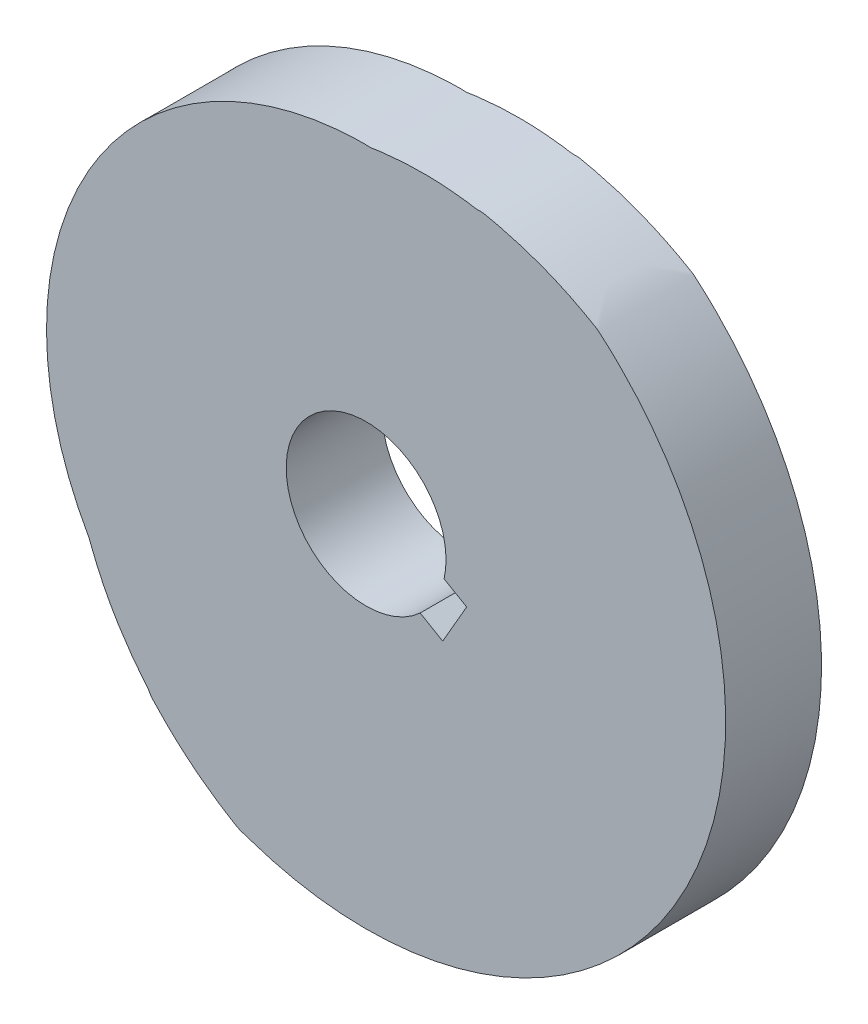
ISO-10303-21;
HEADER;
FILE_DESCRIPTION(('STEP AP214'),'2;1');
FILE_NAME('part.step','',(''),(''),'','','');
FILE_SCHEMA(('AUTOMOTIVE_DESIGN { 1 0 10303 214 1 1 1 1 }'));
ENDSEC;
DATA;
#1=APPLICATION_CONTEXT('core data for automotive mechanical design processes');
#2=APPLICATION_PROTOCOL_DEFINITION('international standard','automotive_design',2000,#1);
#3=PRODUCT_CONTEXT('',#1,'mechanical');
#4=PRODUCT('Part','Part','',(#3));
#5=PRODUCT_RELATED_PRODUCT_CATEGORY('part','',(#4));
#6=PRODUCT_DEFINITION_FORMATION('','',#4);
#7=PRODUCT_DEFINITION_CONTEXT('part definition',#1,'design');
#8=PRODUCT_DEFINITION('design','',#6,#7);
#9=PRODUCT_DEFINITION_SHAPE('','',#8);
#10=(LENGTH_UNIT() NAMED_UNIT(*) SI_UNIT(.MILLI.,.METRE.));
#11=(NAMED_UNIT(*) PLANE_ANGLE_UNIT() SI_UNIT($,.RADIAN.));
#12=(NAMED_UNIT(*) SI_UNIT($,.STERADIAN.) SOLID_ANGLE_UNIT());
#13=UNCERTAINTY_MEASURE_WITH_UNIT(LENGTH_MEASURE(1.E-05),#10,'distance_accuracy_value','');
#14=(GEOMETRIC_REPRESENTATION_CONTEXT(3) GLOBAL_UNCERTAINTY_ASSIGNED_CONTEXT((#13)) GLOBAL_UNIT_ASSIGNED_CONTEXT((#10,
#11,#12)) REPRESENTATION_CONTEXT('',''));
#15=CARTESIAN_POINT('',(0.,0.,0.));
#16=DIRECTION('',(0.,0.,1.));
#17=DIRECTION('',(1.,0.,0.));
#18=AXIS2_PLACEMENT_3D('',#15,#16,#17);
#19=CARTESIAN_POINT('',(-30.4297075312305,-28.4078394957122,12.));
#20=DIRECTION('',(0.,0.,1.));
#21=DIRECTION('',(1.,0.,0.));
#22=AXIS2_PLACEMENT_3D('',#19,#20,#21);
#23=PLANE('',#22);
#24=CARTESIAN_POINT('',(29.1412751431295,34.2897372843891,12.));
#25=CARTESIAN_POINT('',(29.0940531184966,34.3298691174571,12.));
#26=CARTESIAN_POINT('',(28.9994432668749,34.4099376885191,12.));
#27=CARTESIAN_POINT('',(28.8472369154073,34.5189527096457,12.));
#28=CARTESIAN_POINT('',(28.7406854181364,34.5822676387653,12.));
#29=CARTESIAN_POINT('',(28.6873436531217,34.6138134743216,12.));
#30=CARTESIAN_POINT('',(28.3117361485953,34.8359443424741,12.));
#31=CARTESIAN_POINT('',(27.7042465690321,35.183229789973,12.));
#32=CARTESIAN_POINT('',(26.8577301506666,35.6408530107318,12.));
#33=CARTESIAN_POINT('',(26.1581442048839,36.003024963318,12.));
#34=CARTESIAN_POINT('',(25.4541202093224,36.3516653481815,12.));
#35=CARTESIAN_POINT('',(24.7459168548474,36.6867299746915,12.));
#36=CARTESIAN_POINT('',(24.0337929960092,37.0081795325351,12.));
#37=CARTESIAN_POINT('',(23.3180075866082,37.3159796214028,12.));
#38=CARTESIAN_POINT('',(22.5988195740728,37.6101006621444,12.));
#39=CARTESIAN_POINT('',(21.8764878363164,37.8905181682813,12.));
#40=CARTESIAN_POINT('',(21.1512709922592,38.1572116894277,12.));
#41=CARTESIAN_POINT('',(20.4234276756753,38.4101686774383,12.));
#42=CARTESIAN_POINT('',(19.6932150911645,38.649370050824,12.));
#43=CARTESIAN_POINT('',(18.9608939559885,38.874843767902,12.));
#44=CARTESIAN_POINT('',(18.2267097119658,39.0864656457679,12.));
#45=CARTESIAN_POINT('',(17.4909619282007,39.2846994916511,12.));
#46=CARTESIAN_POINT('',(16.7537459630897,39.4678464637026,12.));
#47=CARTESIAN_POINT('',(16.0159125963348,39.6422670098176,12.));
#48=CARTESIAN_POINT('',(15.2755014323008,39.7843939838711,12.));
#49=CARTESIAN_POINT('',(14.5313919262129,39.9844797924808,12.));
#50=CARTESIAN_POINT('',(13.762708354936,39.9054361729313,12.));
#51=CARTESIAN_POINT('',(13.0194376581636,40.0766769337393,12.));
#52=CARTESIAN_POINT('',(12.280322435702,40.163894814137,12.));
#53=CARTESIAN_POINT('',(11.543345691416,40.2557653599944,12.));
#54=CARTESIAN_POINT('',(10.8065917236499,40.3293253185546,12.));
#55=CARTESIAN_POINT('',(10.0708820532317,40.3907640003285,12.));
#56=CARTESIAN_POINT('',(9.33630598468083,40.4384987986659,12.));
#57=CARTESIAN_POINT('',(8.60314610159427,40.473026129899,12.));
#58=CARTESIAN_POINT('',(7.87163127001196,40.4942931868513,12.));
#59=CARTESIAN_POINT('',(7.14200239455789,40.5023995298089,12.));
#60=CARTESIAN_POINT('',(6.41449492124119,40.4974080788568,12.));
#61=CARTESIAN_POINT('',(5.68934287734661,40.479402111312,12.));
#62=CARTESIAN_POINT('',(4.96677967179536,40.4484453581508,12.));
#63=CARTESIAN_POINT('',(4.24703045474375,40.4046841389308,12.));
#64=CARTESIAN_POINT('',(3.53034130696476,40.3479799078984,12.));
#65=CARTESIAN_POINT('',(2.81687013977248,40.279270984584,12.));
#66=CARTESIAN_POINT('',(2.10709178077384,40.1955139130306,12.));
#67=CARTESIAN_POINT('',(1.26956908956307,40.0923796876181,12.));
#68=CARTESIAN_POINT('',(0.673304876887302,39.9673385042817,12.));
#69=CARTESIAN_POINT('',(0.304549506720209,39.973916231467,12.));
#70=CARTESIAN_POINT('',(0.23667807433871,39.9751268979466,12.));
#71=CARTESIAN_POINT('',(0.101034893874037,39.9831366542034,12.));
#72=CARTESIAN_POINT('',(-0.102238967113295,40.0000421412801,12.));
#73=CARTESIAN_POINT('',(-0.238002098786821,39.9993495321864,12.));
#74=CARTESIAN_POINT('',(-0.305882343212708,39.9988304328028,12.));
#75=CARTESIAN_POINT('',(-34.5699432055108,39.7368034907363,12.));
#76=CARTESIAN_POINT('',(-51.6998400740398,10.0608678160656,12.));
#77=CARTESIAN_POINT('',(-34.7894399169696,-19.7406907240745,12.));
#78=CARTESIAN_POINT('',(-34.7569521902894,-19.7979445370832,12.));
#79=CARTESIAN_POINT('',(-34.6916940650224,-19.9122917656152,12.));
#80=CARTESIAN_POINT('',(-34.6076686927563,-20.0925037915658,12.));
#81=CARTESIAN_POINT('',(-34.5623470943252,-20.2161155515386,12.));
#82=CARTESIAN_POINT('',(-34.5395317834891,-20.2778643416509,12.));
#83=CARTESIAN_POINT('',(-34.4093377306533,-20.6302297027969,12.));
#84=CARTESIAN_POINT('',(-34.1883650620063,-21.2029939383914,12.));
#85=CARTESIAN_POINT('',(-33.8630207501085,-21.9912967058105,12.));
#86=CARTESIAN_POINT('',(-33.5776966025202,-22.6488410574114,12.));
#87=CARTESIAN_POINT('',(-33.2797044236173,-23.3031036811853,12.));
#88=CARTESIAN_POINT('',(-32.9690722355443,-23.953842162445,12.));
#89=CARTESIAN_POINT('',(-32.6458326619116,-24.6008140557401,12.));
#90=CARTESIAN_POINT('',(-32.3100229402291,-25.2437769839945,12.));
#91=CARTESIAN_POINT('',(-31.9616849788756,-25.8824887603255,12.));
#92=CARTESIAN_POINT('',(-31.6008651596752,-26.5167073266444,12.));
#93=CARTESIAN_POINT('',(-31.2276151076615,-27.1461914071554,12.));
#94=CARTESIAN_POINT('',(-30.8419888216236,-27.7706984759272,12.));
#95=CARTESIAN_POINT('',(-30.4440534399235,-28.389992795609,12.));
#96=CARTESIAN_POINT('',(-30.0338488866245,-29.0038157051352,12.));
#97=CARTESIAN_POINT('',(-29.6115391276648,-29.6119974147782,12.));
#98=CARTESIAN_POINT('',(-29.1768451935223,-30.2140383797002,12.));
#99=CARTESIAN_POINT('',(-28.7311703662056,-30.810678865856,12.));
#100=CARTESIAN_POINT('',(-28.2696343756967,-31.3980162168542,12.));
#101=CARTESIAN_POINT('',(-27.8109309747662,-31.9895550760374,12.));
#102=CARTESIAN_POINT('',(-27.2780638110927,-32.5411709015464,12.));
#103=CARTESIAN_POINT('',(-26.9464577659519,-33.2437690317535,12.));
#104=CARTESIAN_POINT('',(-26.3883421708551,-33.7811326659886,12.));
#105=CARTESIAN_POINT('',(-25.8817098571886,-34.3452665495698,12.));
#106=CARTESIAN_POINT('',(-25.3486835389016,-34.890469551493,12.));
#107=CARTESIAN_POINT('',(-24.8084489530987,-35.430594759126,12.));
#108=CARTESIAN_POINT('',(-24.2559953041513,-35.961626798261,12.));
#109=CARTESIAN_POINT('',(-23.6928284494156,-36.4843606751622,12.));
#110=CARTESIAN_POINT('',(-23.1187063728304,-36.9982993052098,12.));
#111=CARTESIAN_POINT('',(-22.5338630419058,-37.5032957989598,12.));
#112=CARTESIAN_POINT('',(-21.9384097923243,-37.9991112695572,12.));
#113=CARTESIAN_POINT('',(-21.3324970583894,-38.485535414802,12.));
#114=CARTESIAN_POINT('',(-20.7162682121557,-38.9623486020265,12.));
#115=CARTESIAN_POINT('',(-20.0898816996736,-39.4293530859889,12.));
#116=CARTESIAN_POINT('',(-19.4534684738452,-39.8862863660771,12.));
#117=CARTESIAN_POINT('',(-18.8072804358683,-40.3331382258481,12.));
#118=CARTESIAN_POINT('',(-18.1511369187545,-40.7689652129048,12.));
#119=CARTESIAN_POINT('',(-17.4864979636522,-41.1963330762877,12.));
#120=CARTESIAN_POINT('',(-16.6726514547271,-41.6866282224365,12.));
#121=CARTESIAN_POINT('',(-16.0920045671228,-42.06205154966,12.));
#122=CARTESIAN_POINT('',(-15.6910813545271,-42.2019162446332,12.));
#123=CARTESIAN_POINT('',(-15.6255064966387,-42.224792464339,12.));
#124=CARTESIAN_POINT('',(-15.4925846274541,-42.2654650125444,12.));
#125=CARTESIAN_POINT('',(-15.2919371493583,-42.322229720015,12.));
#126=CARTESIAN_POINT('',(-15.1611926322043,-42.3691286357486,12.));
#127=CARTESIAN_POINT('',(-15.0957664383165,-42.3924266307061,12.));
#128=CARTESIAN_POINT('',(46.2107285986174,-64.2234139976576,12.));
#129=CARTESIAN_POINT('',(78.7299346212942,-7.85339020145637,12.));
#130=CARTESIAN_POINT('',(29.1412751431295,34.2897372843891,12.));
#131=(BOUNDED_CURVE() B_SPLINE_CURVE(3,(#24,#25,#26,#27,#28,#29,#30,#31,#32,#33,#34,#35,#36,#37,
#38,#39,#40,#41,#42,#43,#44,#45,#46,#47,#48,#49,#50,#51,#52,#53,#54,#55,#56,#57,#58,#59,#60,#61,
#62,#63,#64,#65,#66,#67,#68,#69,#70,#71,#72,#73,#74,#75,#76,#77,#78,#79,#80,#81,#82,#83,#84,#85,
#86,#87,#88,#89,#90,#91,#92,#93,#94,#95,#96,#97,#98,#99,#100,#101,#102,#103,#104,#105,#106,#107,
#108,#109,#110,#111,#112,#113,#114,#115,#116,#117,#118,#119,#120,#121,#122,#123,#124,#125,#126,
#127,#128,#129,#130),.UNSPECIFIED.,.T.,.F.) B_SPLINE_CURVE_WITH_KNOTS((4,1,1,3,1,1,1,1,1,1,1,1,
1,1,1,1,1,1,1,1,1,1,1,1,1,1,1,1,1,1,1,1,1,1,1,1,1,1,1,1,1,3,1,1,3,3,1,1,3,1,1,1,1,1,1,1,1,1,1,1,
1,1,1,1,1,1,1,1,1,1,1,1,1,1,1,1,1,1,1,1,1,1,1,1,1,1,3,1,1,3,4),(0.,0.000850502477614867,
0.00170100495522973,0.0025515074328446,0.00854034400626003,0.0121538764877187,
0.0157575546443932,0.0193513791722436,0.0229353507729708,0.0265094701540788,0.0300737380289383,
0.0336281551168521,0.0371727221431197,0.0407074398391042,0.0442323089422995,0.0477473301963987,
0.0512525043513629,0.0547478321634917,0.0582333143954945,0.061708951816562,0.0651747452024399,
0.0686306953355029,0.0720768030048299,0.0756482273526375,0.0790648124334217,0.0824715582753685,
0.0858684657022437,0.0892555355449914,0.0926327686418171,0.0960001658382718,0.0993577279873376,
0.102705455949514,0.106043350592908,0.109371412793318,0.112689643434332,0.115998043407411,
0.11929661361199,0.122585354955567,0.125864268353801,0.129133354730611,0.132392615018271,
0.137450464963668,0.138381389767375,0.139312314571083,0.14024323937479,0.455559304746882,
0.456462071331177,0.457364837915473,0.458267604499769,0.463419181930307,0.466685829892808,
0.46996229754675,0.473248585815361,0.476544695613619,0.479850627848344,0.4831663834183,
0.486491963214284,0.489827368119224,0.493172599008267,0.49652765674887,0.499892542200892,
0.503267256216678,0.506651799641149,0.510046173311885,0.513450378059211,0.516864414706277,
0.520288284069144,0.523721986956861,0.527309648728311,0.530772856975955,0.534245901916114,
0.537728784323955,0.541221504968096,0.544724064610677,0.548236464007432,0.551758703907766,
0.555290785054814,0.558832708185522,0.562384474030707,0.565946083315127,0.569517536757549,
0.57309883507081,0.576689978961889,0.580290969131961,0.583901806276468,0.587522491085178,
0.593333175185337,0.594283568607703,0.595233962030068,0.596184355452434,1.),
.UNSPECIFIED.) CURVE() GEOMETRIC_REPRESENTATION_ITEM() RATIONAL_B_SPLINE_CURVE((1.,1.,1.,1.,1.,
1.,1.,1.,1.,1.,1.,1.,1.,1.,1.,1.,1.,1.,1.,1.,1.,1.,1.,1.,1.,1.,1.,1.,1.,1.,1.,1.,1.,1.,1.,1.,1.,
1.,1.,1.,1.,1.,1.,1.,1.,1.,1.,1.,1.,1.,1.,0.671020922044779,0.671020922044779,1.,1.,1.,1.,1.,1.,
1.,1.,1.,1.,1.,1.,1.,1.,1.,1.,1.,1.,1.,1.,1.,1.,1.,1.,1.,1.,1.,1.,1.,1.,1.,1.,1.,1.,1.,1.,1.,1.,
1.,1.,1.,1.,1.,1.,1.,1.,1.,1.,1.,1.,1.,0.453445281439712,0.453445281439712,1.)) REPRESENTATION_ITEM(''));
#132=CARTESIAN_POINT('',(29.1412751431295,34.2897372843891,12.));
#133=VERTEX_POINT('',#132);
#134=EDGE_CURVE('E119',#133,#133,#131,.T.);
#135=ORIENTED_EDGE('',*,*,#134,.T.);
#136=EDGE_LOOP('',(#135));
#137=FACE_BOUND('',#136,.T.);
#138=DIRECTION('',(0.866025403784439,-0.5,0.));
#139=VECTOR('',#138,1.);
#140=CARTESIAN_POINT('',(9.58512512714551,-8.99807618751146,12.));
#141=LINE('',#140,#139);
#142=CARTESIAN_POINT('',(6.76135582092916,-7.36777221843804,12.));
#143=VERTEX_POINT('',#142);
#144=CARTESIAN_POINT('',(9.58512512714551,-8.99807618751146,12.));
#145=VERTEX_POINT('',#144);
#146=EDGE_CURVE('E93',#143,#145,#141,.T.);
#147=ORIENTED_EDGE('',*,*,#146,.F.);
#148=CARTESIAN_POINT('',(0.,0.,12.));
#149=DIRECTION('',(0.,0.,1.));
#150=DIRECTION('',(1.,0.,0.));
#151=AXIS2_PLACEMENT_3D('',#148,#149,#150);
#152=CIRCLE('',#151,10.);
#153=CARTESIAN_POINT('',(9.76135582092916,-2.17161979573141,12.));
#154=VERTEX_POINT('',#153);
#155=EDGE_CURVE('E84',#154,#143,#152,.T.);
#156=ORIENTED_EDGE('',*,*,#155,.F.);
#157=DIRECTION('',(-0.866025403784439,0.5,0.));
#158=VECTOR('',#157,1.);
#159=CARTESIAN_POINT('',(9.76135582092916,-2.17161979573141,12.));
#160=LINE('',#159,#158);
#161=CARTESIAN_POINT('',(12.5851251271455,-3.80192376480482,12.));
#162=VERTEX_POINT('',#161);
#163=EDGE_CURVE('E109',#162,#154,#160,.T.);
#164=ORIENTED_EDGE('',*,*,#163,.F.);
#165=DIRECTION('',(0.5,0.866025403784439,0.));
#166=VECTOR('',#165,1.);
#167=CARTESIAN_POINT('',(12.5851251271455,-3.80192376480482,12.));
#168=LINE('',#167,#166);
#169=EDGE_CURVE('E105',#145,#162,#168,.T.);
#170=ORIENTED_EDGE('',*,*,#169,.F.);
#171=EDGE_LOOP('',(#147,#156,#164,#170));
#172=FACE_BOUND('',#171,.T.);
#173=ADVANCED_FACE('F43',(#137,#172),#23,.T.);
#174=CARTESIAN_POINT('',(-30.4297075312305,-28.4078394957122,0.));
#175=DIRECTION('',(0.,0.,1.));
#176=DIRECTION('',(1.,0.,0.));
#177=AXIS2_PLACEMENT_3D('',#174,#175,#176);
#178=PLANE('',#177);
#179=CARTESIAN_POINT('',(29.1412751431295,34.2897372843891,0.));
#180=CARTESIAN_POINT('',(29.0940531184966,34.3298691174571,0.));
#181=CARTESIAN_POINT('',(28.9994432668749,34.4099376885191,0.));
#182=CARTESIAN_POINT('',(28.8472369154073,34.5189527096457,0.));
#183=CARTESIAN_POINT('',(28.7406854181364,34.5822676387653,0.));
#184=CARTESIAN_POINT('',(28.6873436531217,34.6138134743216,0.));
#185=CARTESIAN_POINT('',(28.3117361485953,34.8359443424741,0.));
#186=CARTESIAN_POINT('',(27.7042465690321,35.183229789973,0.));
#187=CARTESIAN_POINT('',(26.8577301506666,35.6408530107318,0.));
#188=CARTESIAN_POINT('',(26.1581442048839,36.003024963318,0.));
#189=CARTESIAN_POINT('',(25.4541202093224,36.3516653481815,0.));
#190=CARTESIAN_POINT('',(24.7459168548474,36.6867299746915,0.));
#191=CARTESIAN_POINT('',(24.0337929960092,37.0081795325351,0.));
#192=CARTESIAN_POINT('',(23.3180075866082,37.3159796214028,0.));
#193=CARTESIAN_POINT('',(22.5988195740728,37.6101006621444,0.));
#194=CARTESIAN_POINT('',(21.8764878363164,37.8905181682813,0.));
#195=CARTESIAN_POINT('',(21.1512709922592,38.1572116894277,0.));
#196=CARTESIAN_POINT('',(20.4234276756753,38.4101686774383,0.));
#197=CARTESIAN_POINT('',(19.6932150911645,38.649370050824,0.));
#198=CARTESIAN_POINT('',(18.9608939559885,38.874843767902,0.));
#199=CARTESIAN_POINT('',(18.2267097119658,39.0864656457679,0.));
#200=CARTESIAN_POINT('',(17.4909619282007,39.2846994916511,0.));
#201=CARTESIAN_POINT('',(16.7537459630897,39.4678464637026,0.));
#202=CARTESIAN_POINT('',(16.0159125963348,39.6422670098176,0.));
#203=CARTESIAN_POINT('',(15.2755014323008,39.7843939838711,0.));
#204=CARTESIAN_POINT('',(14.5313919262129,39.9844797924808,0.));
#205=CARTESIAN_POINT('',(13.762708354936,39.9054361729313,0.));
#206=CARTESIAN_POINT('',(13.0194376581636,40.0766769337393,0.));
#207=CARTESIAN_POINT('',(12.280322435702,40.163894814137,0.));
#208=CARTESIAN_POINT('',(11.543345691416,40.2557653599944,0.));
#209=CARTESIAN_POINT('',(10.8065917236499,40.3293253185546,0.));
#210=CARTESIAN_POINT('',(10.0708820532317,40.3907640003285,0.));
#211=CARTESIAN_POINT('',(9.33630598468083,40.4384987986659,0.));
#212=CARTESIAN_POINT('',(8.60314610159427,40.473026129899,0.));
#213=CARTESIAN_POINT('',(7.87163127001196,40.4942931868513,0.));
#214=CARTESIAN_POINT('',(7.14200239455789,40.5023995298089,0.));
#215=CARTESIAN_POINT('',(6.41449492124119,40.4974080788568,0.));
#216=CARTESIAN_POINT('',(5.68934287734661,40.479402111312,0.));
#217=CARTESIAN_POINT('',(4.96677967179536,40.4484453581508,0.));
#218=CARTESIAN_POINT('',(4.24703045474375,40.4046841389308,0.));
#219=CARTESIAN_POINT('',(3.53034130696476,40.3479799078984,0.));
#220=CARTESIAN_POINT('',(2.81687013977248,40.279270984584,0.));
#221=CARTESIAN_POINT('',(2.10709178077384,40.1955139130306,0.));
#222=CARTESIAN_POINT('',(1.26956908956307,40.0923796876181,0.));
#223=CARTESIAN_POINT('',(0.673304876887302,39.9673385042817,0.));
#224=CARTESIAN_POINT('',(0.304549506720209,39.973916231467,0.));
#225=CARTESIAN_POINT('',(0.23667807433871,39.9751268979466,0.));
#226=CARTESIAN_POINT('',(0.101034893874037,39.9831366542034,0.));
#227=CARTESIAN_POINT('',(-0.102238967113295,40.0000421412801,0.));
#228=CARTESIAN_POINT('',(-0.238002098786821,39.9993495321864,0.));
#229=CARTESIAN_POINT('',(-0.305882343212708,39.9988304328028,0.));
#230=CARTESIAN_POINT('',(-34.5699432055108,39.7368034907363,0.));
#231=CARTESIAN_POINT('',(-51.6998400740398,10.0608678160656,0.));
#232=CARTESIAN_POINT('',(-34.7894399169696,-19.7406907240745,0.));
#233=CARTESIAN_POINT('',(-34.7569521902894,-19.7979445370832,0.));
#234=CARTESIAN_POINT('',(-34.6916940650224,-19.9122917656152,0.));
#235=CARTESIAN_POINT('',(-34.6076686927563,-20.0925037915658,0.));
#236=CARTESIAN_POINT('',(-34.5623470943252,-20.2161155515386,0.));
#237=CARTESIAN_POINT('',(-34.5395317834891,-20.2778643416509,0.));
#238=CARTESIAN_POINT('',(-34.4093377306533,-20.6302297027969,0.));
#239=CARTESIAN_POINT('',(-34.1883650620063,-21.2029939383914,0.));
#240=CARTESIAN_POINT('',(-33.8630207501085,-21.9912967058105,0.));
#241=CARTESIAN_POINT('',(-33.5776966025202,-22.6488410574114,0.));
#242=CARTESIAN_POINT('',(-33.2797044236173,-23.3031036811853,0.));
#243=CARTESIAN_POINT('',(-32.9690722355443,-23.953842162445,0.));
#244=CARTESIAN_POINT('',(-32.6458326619116,-24.6008140557401,0.));
#245=CARTESIAN_POINT('',(-32.3100229402291,-25.2437769839945,0.));
#246=CARTESIAN_POINT('',(-31.9616849788756,-25.8824887603255,0.));
#247=CARTESIAN_POINT('',(-31.6008651596752,-26.5167073266444,0.));
#248=CARTESIAN_POINT('',(-31.2276151076615,-27.1461914071554,0.));
#249=CARTESIAN_POINT('',(-30.8419888216236,-27.7706984759272,0.));
#250=CARTESIAN_POINT('',(-30.4440534399235,-28.389992795609,0.));
#251=CARTESIAN_POINT('',(-30.0338488866245,-29.0038157051352,0.));
#252=CARTESIAN_POINT('',(-29.6115391276648,-29.6119974147782,0.));
#253=CARTESIAN_POINT('',(-29.1768451935223,-30.2140383797002,0.));
#254=CARTESIAN_POINT('',(-28.7311703662056,-30.810678865856,0.));
#255=CARTESIAN_POINT('',(-28.2696343756967,-31.3980162168542,0.));
#256=CARTESIAN_POINT('',(-27.8109309747662,-31.9895550760374,0.));
#257=CARTESIAN_POINT('',(-27.2780638110927,-32.5411709015464,0.));
#258=CARTESIAN_POINT('',(-26.9464577659519,-33.2437690317535,0.));
#259=CARTESIAN_POINT('',(-26.3883421708551,-33.7811326659886,0.));
#260=CARTESIAN_POINT('',(-25.8817098571886,-34.3452665495698,0.));
#261=CARTESIAN_POINT('',(-25.3486835389016,-34.890469551493,0.));
#262=CARTESIAN_POINT('',(-24.8084489530987,-35.430594759126,0.));
#263=CARTESIAN_POINT('',(-24.2559953041513,-35.961626798261,0.));
#264=CARTESIAN_POINT('',(-23.6928284494156,-36.4843606751622,0.));
#265=CARTESIAN_POINT('',(-23.1187063728304,-36.9982993052098,0.));
#266=CARTESIAN_POINT('',(-22.5338630419058,-37.5032957989598,0.));
#267=CARTESIAN_POINT('',(-21.9384097923243,-37.9991112695572,0.));
#268=CARTESIAN_POINT('',(-21.3324970583894,-38.485535414802,0.));
#269=CARTESIAN_POINT('',(-20.7162682121557,-38.9623486020265,0.));
#270=CARTESIAN_POINT('',(-20.0898816996736,-39.4293530859889,0.));
#271=CARTESIAN_POINT('',(-19.4534684738452,-39.8862863660771,0.));
#272=CARTESIAN_POINT('',(-18.8072804358683,-40.3331382258481,0.));
#273=CARTESIAN_POINT('',(-18.1511369187545,-40.7689652129048,0.));
#274=CARTESIAN_POINT('',(-17.4864979636522,-41.1963330762877,0.));
#275=CARTESIAN_POINT('',(-16.6726514547271,-41.6866282224365,0.));
#276=CARTESIAN_POINT('',(-16.0920045671228,-42.06205154966,0.));
#277=CARTESIAN_POINT('',(-15.6910813545271,-42.2019162446332,0.));
#278=CARTESIAN_POINT('',(-15.6255064966387,-42.224792464339,0.));
#279=CARTESIAN_POINT('',(-15.4925846274541,-42.2654650125444,0.));
#280=CARTESIAN_POINT('',(-15.2919371493583,-42.322229720015,0.));
#281=CARTESIAN_POINT('',(-15.1611926322043,-42.3691286357486,0.));
#282=CARTESIAN_POINT('',(-15.0957664383165,-42.3924266307061,0.));
#283=CARTESIAN_POINT('',(46.2107285986174,-64.2234139976576,0.));
#284=CARTESIAN_POINT('',(78.7299346212942,-7.85339020145637,0.));
#285=CARTESIAN_POINT('',(29.1412751431295,34.2897372843891,0.));
#286=(BOUNDED_CURVE() B_SPLINE_CURVE(3,(#179,#180,#181,#182,#183,#184,#185,#186,#187,#188,#189,
#190,#191,#192,#193,#194,#195,#196,#197,#198,#199,#200,#201,#202,#203,#204,#205,#206,#207,#208,
#209,#210,#211,#212,#213,#214,#215,#216,#217,#218,#219,#220,#221,#222,#223,#224,#225,#226,#227,
#228,#229,#230,#231,#232,#233,#234,#235,#236,#237,#238,#239,#240,#241,#242,#243,#244,#245,#246,
#247,#248,#249,#250,#251,#252,#253,#254,#255,#256,#257,#258,#259,#260,#261,#262,#263,#264,#265,
#266,#267,#268,#269,#270,#271,#272,#273,#274,#275,#276,#277,#278,#279,#280,#281,#282,#283,#284,
#285),.UNSPECIFIED.,.T.,.F.) B_SPLINE_CURVE_WITH_KNOTS((4,1,1,3,1,1,1,1,1,1,1,1,1,1,1,1,1,1,1,1,
1,1,1,1,1,1,1,1,1,1,1,1,1,1,1,1,1,1,1,1,1,3,1,1,3,3,1,1,3,1,1,1,1,1,1,1,1,1,1,1,1,1,1,1,1,1,1,1,
1,1,1,1,1,1,1,1,1,1,1,1,1,1,1,1,1,1,3,1,1,3,4),(0.,0.000850502477614867,0.00170100495522973,
0.0025515074328446,0.00854034400626003,0.0121538764877187,0.0157575546443932,0.0193513791722436,
0.0229353507729708,0.0265094701540788,0.0300737380289383,0.0336281551168521,0.0371727221431197,
0.0407074398391042,0.0442323089422995,0.0477473301963987,0.0512525043513629,0.0547478321634917,
0.0582333143954945,0.061708951816562,0.0651747452024399,0.0686306953355029,0.0720768030048299,
0.0756482273526375,0.0790648124334217,0.0824715582753685,0.0858684657022437,0.0892555355449914,
0.0926327686418171,0.0960001658382718,0.0993577279873376,0.102705455949514,0.106043350592908,
0.109371412793318,0.112689643434332,0.115998043407411,0.11929661361199,0.122585354955567,
0.125864268353801,0.129133354730611,0.132392615018271,0.137450464963668,0.138381389767375,
0.139312314571083,0.14024323937479,0.455559304746882,0.456462071331177,0.457364837915473,
0.458267604499769,0.463419181930307,0.466685829892808,0.46996229754675,0.473248585815361,
0.476544695613619,0.479850627848344,0.4831663834183,0.486491963214284,0.489827368119224,
0.493172599008267,0.49652765674887,0.499892542200892,0.503267256216678,0.506651799641149,
0.510046173311885,0.513450378059211,0.516864414706277,0.520288284069144,0.523721986956861,
0.527309648728311,0.530772856975955,0.534245901916114,0.537728784323955,0.541221504968096,
0.544724064610677,0.548236464007432,0.551758703907766,0.555290785054814,0.558832708185522,
0.562384474030707,0.565946083315127,0.569517536757549,0.57309883507081,0.576689978961889,
0.580290969131961,0.583901806276468,0.587522491085178,0.593333175185337,0.594283568607703,
0.595233962030068,0.596184355452434,1.),
.UNSPECIFIED.) CURVE() GEOMETRIC_REPRESENTATION_ITEM() RATIONAL_B_SPLINE_CURVE((1.,1.,1.,1.,1.,
1.,1.,1.,1.,1.,1.,1.,1.,1.,1.,1.,1.,1.,1.,1.,1.,1.,1.,1.,1.,1.,1.,1.,1.,1.,1.,1.,1.,1.,1.,1.,1.,
1.,1.,1.,1.,1.,1.,1.,1.,1.,1.,1.,1.,1.,1.,0.671020922044779,0.671020922044779,1.,1.,1.,1.,1.,1.,
1.,1.,1.,1.,1.,1.,1.,1.,1.,1.,1.,1.,1.,1.,1.,1.,1.,1.,1.,1.,1.,1.,1.,1.,1.,1.,1.,1.,1.,1.,1.,1.,
1.,1.,1.,1.,1.,1.,1.,1.,1.,1.,1.,1.,1.,0.453445281439712,0.453445281439712,1.)) REPRESENTATION_ITEM(''));
#287=CARTESIAN_POINT('',(29.1412751431295,34.2897372843891,0.));
#288=VERTEX_POINT('',#287);
#289=EDGE_CURVE('E101',#288,#288,#286,.T.);
#290=ORIENTED_EDGE('',*,*,#289,.F.);
#291=EDGE_LOOP('',(#290));
#292=FACE_BOUND('',#291,.T.);
#293=CARTESIAN_POINT('',(0.,0.,0.));
#294=DIRECTION('',(0.,0.,1.));
#295=DIRECTION('',(1.,0.,0.));
#296=AXIS2_PLACEMENT_3D('',#293,#294,#295);
#297=CIRCLE('',#296,10.);
#298=CARTESIAN_POINT('',(6.76135582092916,-7.36777221843804,0.));
#299=VERTEX_POINT('',#298);
#300=CARTESIAN_POINT('',(9.76135582092916,-2.17161979573141,0.));
#301=VERTEX_POINT('',#300);
#302=EDGE_CURVE('E11',#299,#301,#297,.F.);
#303=ORIENTED_EDGE('',*,*,#302,.F.);
#304=DIRECTION('',(-0.866025403784439,0.5,0.));
#305=VECTOR('',#304,1.);
#306=CARTESIAN_POINT('',(-12.021325313464,3.47641379060675,0.));
#307=LINE('',#306,#305);
#308=CARTESIAN_POINT('',(9.58512512714551,-8.99807618751146,0.));
#309=VERTEX_POINT('',#308);
#310=EDGE_CURVE('E53',#309,#299,#307,.T.);
#311=ORIENTED_EDGE('',*,*,#310,.F.);
#312=DIRECTION('',(-0.5,-0.866025403784439,0.));
#313=VECTOR('',#312,1.);
#314=CARTESIAN_POINT('',(-8.82325709062094,-40.8823294738304,0.));
#315=LINE('',#314,#313);
#316=CARTESIAN_POINT('',(12.5851251271455,-3.80192376480482,0.));
#317=VERTEX_POINT('',#316);
#318=EDGE_CURVE('E140',#317,#309,#315,.T.);
#319=ORIENTED_EDGE('',*,*,#318,.F.);
#320=DIRECTION('',(0.866025403784439,-0.5,0.));
#321=VECTOR('',#320,1.);
#322=CARTESIAN_POINT('',(-9.02132531346402,8.67256621331339,0.));
#323=LINE('',#322,#321);
#324=EDGE_CURVE('E126',#301,#317,#323,.T.);
#325=ORIENTED_EDGE('',*,*,#324,.F.);
#326=EDGE_LOOP('',(#303,#311,#319,#325));
#327=FACE_BOUND('',#326,.T.);
#328=ADVANCED_FACE('F148',(#292,#327),#178,.F.);
#329=DIRECTION('',(0.,0.,-1.));
#330=VECTOR('',#329,1.);
#331=SURFACE_OF_LINEAR_EXTRUSION('',#131,#330);
#332=ORIENTED_EDGE('',*,*,#134,.F.);
#333=EDGE_LOOP('',(#332));
#334=FACE_BOUND('',#333,.T.);
#335=ORIENTED_EDGE('',*,*,#289,.T.);
#336=EDGE_LOOP('',(#335));
#337=FACE_BOUND('',#336,.T.);
#338=ADVANCED_FACE('F45',(#334,#337),#331,.F.);
#339=CARTESIAN_POINT('',(0.,0.,12.));
#340=DIRECTION('',(0.,0.,-1.));
#341=DIRECTION('',(-1.,0.,0.));
#342=AXIS2_PLACEMENT_3D('',#339,#340,#341);
#343=CYLINDRICAL_SURFACE('',#342,10.);
#344=ORIENTED_EDGE('',*,*,#302,.T.);
#345=DIRECTION('',(0.,0.,-1.));
#346=VECTOR('',#345,1.);
#347=CARTESIAN_POINT('',(9.76135582092916,-2.17161979573141,12.));
#348=LINE('',#347,#346);
#349=EDGE_CURVE('E65',#154,#301,#348,.T.);
#350=ORIENTED_EDGE('',*,*,#349,.F.);
#351=ORIENTED_EDGE('',*,*,#155,.T.);
#352=DIRECTION('',(0.,0.,-1.));
#353=VECTOR('',#352,1.);
#354=CARTESIAN_POINT('',(6.76135582092916,-7.36777221843804,12.));
#355=LINE('',#354,#353);
#356=EDGE_CURVE('E87',#143,#299,#355,.T.);
#357=ORIENTED_EDGE('',*,*,#356,.T.);
#358=EDGE_LOOP('',(#344,#350,#351,#357));
#359=FACE_BOUND('',#358,.T.);
#360=ADVANCED_FACE('F86',(#359),#343,.F.);
#361=CARTESIAN_POINT('',(9.58512512714551,-8.99807618751146,12.));
#362=DIRECTION('',(0.5,0.866025403784439,0.));
#363=DIRECTION('',(-0.866025403784439,0.5,0.));
#364=AXIS2_PLACEMENT_3D('',#361,#362,#363);
#365=PLANE('',#364);
#366=ORIENTED_EDGE('',*,*,#310,.T.);
#367=ORIENTED_EDGE('',*,*,#356,.F.);
#368=ORIENTED_EDGE('',*,*,#146,.T.);
#369=DIRECTION('',(0.,0.,-1.));
#370=VECTOR('',#369,1.);
#371=CARTESIAN_POINT('',(9.58512512714551,-8.99807618751146,12.));
#372=LINE('',#371,#370);
#373=EDGE_CURVE('E102',#145,#309,#372,.T.);
#374=ORIENTED_EDGE('',*,*,#373,.T.);
#375=EDGE_LOOP('',(#366,#367,#368,#374));
#376=FACE_BOUND('',#375,.T.);
#377=ADVANCED_FACE('F96',(#376),#365,.T.);
#378=CARTESIAN_POINT('',(12.5851251271455,-3.80192376480482,12.));
#379=DIRECTION('',(-0.866025403784439,0.5,0.));
#380=DIRECTION('',(-0.5,-0.866025403784439,0.));
#381=AXIS2_PLACEMENT_3D('',#378,#379,#380);
#382=PLANE('',#381);
#383=ORIENTED_EDGE('',*,*,#318,.T.);
#384=ORIENTED_EDGE('',*,*,#373,.F.);
#385=ORIENTED_EDGE('',*,*,#169,.T.);
#386=DIRECTION('',(0.,0.,-1.));
#387=VECTOR('',#386,1.);
#388=CARTESIAN_POINT('',(12.5851251271455,-3.80192376480482,12.));
#389=LINE('',#388,#387);
#390=EDGE_CURVE('E60',#162,#317,#389,.T.);
#391=ORIENTED_EDGE('',*,*,#390,.T.);
#392=EDGE_LOOP('',(#383,#384,#385,#391));
#393=FACE_BOUND('',#392,.T.);
#394=ADVANCED_FACE('F145',(#393),#382,.T.);
#395=CARTESIAN_POINT('',(9.76135582092916,-2.17161979573141,12.));
#396=DIRECTION('',(-0.5,-0.866025403784439,0.));
#397=DIRECTION('',(0.866025403784439,-0.5,0.));
#398=AXIS2_PLACEMENT_3D('',#395,#396,#397);
#399=PLANE('',#398);
#400=ORIENTED_EDGE('',*,*,#324,.T.);
#401=ORIENTED_EDGE('',*,*,#390,.F.);
#402=ORIENTED_EDGE('',*,*,#163,.T.);
#403=ORIENTED_EDGE('',*,*,#349,.T.);
#404=EDGE_LOOP('',(#400,#401,#402,#403));
#405=FACE_BOUND('',#404,.T.);
#406=ADVANCED_FACE('F149',(#405),#399,.T.);
#407=CLOSED_SHELL('',(#173,#328,#338,#360,#377,#394,#406));
#408=MANIFOLD_SOLID_BREP('B2',#407);
#409=ADVANCED_BREP_SHAPE_REPRESENTATION('',(#18,#408),#14);
#410=SHAPE_DEFINITION_REPRESENTATION(#9,#409);
ENDSEC;
END-ISO-10303-21;
